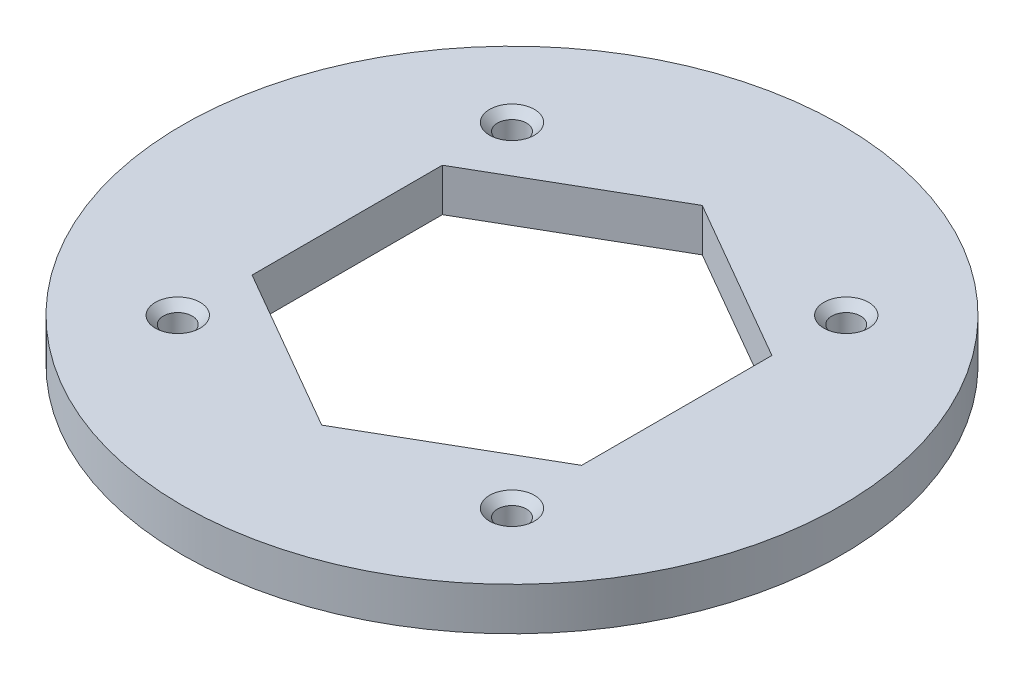
ISO-10303-21;
HEADER;
FILE_DESCRIPTION(('STEP AP214'),'2;1');
FILE_NAME('part.step','',(''),(''),'','','');
FILE_SCHEMA(('AUTOMOTIVE_DESIGN { 1 0 10303 214 1 1 1 1 }'));
ENDSEC;
DATA;
#1=APPLICATION_CONTEXT('core data for automotive mechanical design processes');
#2=APPLICATION_PROTOCOL_DEFINITION('international standard','automotive_design',2000,#1);
#3=PRODUCT_CONTEXT('',#1,'mechanical');
#4=PRODUCT('Part','Part','',(#3));
#5=PRODUCT_RELATED_PRODUCT_CATEGORY('part','',(#4));
#6=PRODUCT_DEFINITION_FORMATION('','',#4);
#7=PRODUCT_DEFINITION_CONTEXT('part definition',#1,'design');
#8=PRODUCT_DEFINITION('design','',#6,#7);
#9=PRODUCT_DEFINITION_SHAPE('','',#8);
#10=(LENGTH_UNIT() NAMED_UNIT(*) SI_UNIT(.MILLI.,.METRE.));
#11=(NAMED_UNIT(*) PLANE_ANGLE_UNIT() SI_UNIT($,.RADIAN.));
#12=(NAMED_UNIT(*) SI_UNIT($,.STERADIAN.) SOLID_ANGLE_UNIT());
#13=UNCERTAINTY_MEASURE_WITH_UNIT(LENGTH_MEASURE(1.E-05),#10,'distance_accuracy_value','');
#14=(GEOMETRIC_REPRESENTATION_CONTEXT(3) GLOBAL_UNCERTAINTY_ASSIGNED_CONTEXT((#13)) GLOBAL_UNIT_ASSIGNED_CONTEXT((#10,
#11,#12)) REPRESENTATION_CONTEXT('',''));
#15=CARTESIAN_POINT('',(0.,0.,0.));
#16=DIRECTION('',(0.,0.,1.));
#17=DIRECTION('',(1.,0.,0.));
#18=AXIS2_PLACEMENT_3D('',#15,#16,#17);
#19=CARTESIAN_POINT('',(0.,6.5,0.));
#20=DIRECTION('',(0.,-1.,0.));
#21=DIRECTION('',(0.,0.,-1.));
#22=AXIS2_PLACEMENT_3D('',#19,#20,#21);
#23=CYLINDRICAL_SURFACE('',#22,50.);
#24=CARTESIAN_POINT('',(0.,6.5,0.));
#25=DIRECTION('',(0.,1.,0.));
#26=DIRECTION('',(0.,0.,1.));
#27=AXIS2_PLACEMENT_3D('',#24,#25,#26);
#28=CIRCLE('',#27,50.);
#29=CARTESIAN_POINT('',(0.,6.5,-50.));
#30=VERTEX_POINT('',#29);
#31=EDGE_CURVE('E161',#30,#30,#28,.T.);
#32=CARTESIAN_POINT('',(0.,0.,0.));
#33=DIRECTION('',(0.,1.,0.));
#34=DIRECTION('',(0.,0.,1.));
#35=AXIS2_PLACEMENT_3D('',#32,#33,#34);
#36=CIRCLE('',#35,50.);
#37=CARTESIAN_POINT('',(0.,0.,-50.));
#38=VERTEX_POINT('',#37);
#39=EDGE_CURVE('E178',#38,#38,#36,.T.);
#40=CARTESIAN_POINT('',(0.,6.5,-50.));
#41=CARTESIAN_POINT('',(0.,6.43229166666667,-50.));
#42=CARTESIAN_POINT('',(0.,6.36458333333333,-50.));
#43=CARTESIAN_POINT('',(0.,6.22916666666667,-50.));
#44=CARTESIAN_POINT('',(0.,6.16145833333333,-50.));
#45=CARTESIAN_POINT('',(0.,6.02604166666667,-50.));
#46=CARTESIAN_POINT('',(0.,5.95833333333333,-50.));
#47=CARTESIAN_POINT('',(0.,5.82291666666667,-50.));
#48=CARTESIAN_POINT('',(0.,5.75520833333333,-50.));
#49=CARTESIAN_POINT('',(0.,5.61979166666667,-50.));
#50=CARTESIAN_POINT('',(0.,5.55208333333333,-50.));
#51=CARTESIAN_POINT('',(0.,5.41666666666667,-50.));
#52=CARTESIAN_POINT('',(0.,5.34895833333333,-50.));
#53=CARTESIAN_POINT('',(0.,5.21354166666667,-50.));
#54=CARTESIAN_POINT('',(0.,5.14583333333333,-50.));
#55=CARTESIAN_POINT('',(0.,5.01041666666667,-50.));
#56=CARTESIAN_POINT('',(0.,4.94270833333333,-50.));
#57=CARTESIAN_POINT('',(0.,4.80729166666667,-50.));
#58=CARTESIAN_POINT('',(0.,4.73958333333333,-50.));
#59=CARTESIAN_POINT('',(0.,4.60416666666667,-50.));
#60=CARTESIAN_POINT('',(0.,4.53645833333333,-50.));
#61=CARTESIAN_POINT('',(0.,4.40104166666667,-50.));
#62=CARTESIAN_POINT('',(0.,4.33333333333333,-50.));
#63=CARTESIAN_POINT('',(0.,4.19791666666667,-50.));
#64=CARTESIAN_POINT('',(0.,4.13020833333333,-50.));
#65=CARTESIAN_POINT('',(0.,3.99479166666667,-50.));
#66=CARTESIAN_POINT('',(0.,3.92708333333333,-50.));
#67=CARTESIAN_POINT('',(0.,3.79166666666667,-50.));
#68=CARTESIAN_POINT('',(0.,3.72395833333333,-50.));
#69=CARTESIAN_POINT('',(0.,3.58854166666667,-50.));
#70=CARTESIAN_POINT('',(0.,3.52083333333333,-50.));
#71=CARTESIAN_POINT('',(0.,3.38541666666667,-50.));
#72=CARTESIAN_POINT('',(0.,3.31770833333333,-50.));
#73=CARTESIAN_POINT('',(0.,3.18229166666667,-50.));
#74=CARTESIAN_POINT('',(0.,3.11458333333333,-50.));
#75=CARTESIAN_POINT('',(0.,2.97916666666667,-50.));
#76=CARTESIAN_POINT('',(0.,2.91145833333333,-50.));
#77=CARTESIAN_POINT('',(0.,2.77604166666667,-50.));
#78=CARTESIAN_POINT('',(0.,2.70833333333333,-50.));
#79=CARTESIAN_POINT('',(0.,2.57291666666667,-50.));
#80=CARTESIAN_POINT('',(0.,2.50520833333333,-50.));
#81=CARTESIAN_POINT('',(0.,2.36979166666667,-50.));
#82=CARTESIAN_POINT('',(0.,2.30208333333333,-50.));
#83=CARTESIAN_POINT('',(0.,2.16666666666667,-50.));
#84=CARTESIAN_POINT('',(0.,2.09895833333333,-50.));
#85=CARTESIAN_POINT('',(0.,1.96354166666667,-50.));
#86=CARTESIAN_POINT('',(0.,1.89583333333333,-50.));
#87=CARTESIAN_POINT('',(0.,1.76041666666667,-50.));
#88=CARTESIAN_POINT('',(0.,1.69270833333333,-50.));
#89=CARTESIAN_POINT('',(0.,1.55729166666667,-50.));
#90=CARTESIAN_POINT('',(0.,1.48958333333333,-50.));
#91=CARTESIAN_POINT('',(0.,1.35416666666667,-50.));
#92=CARTESIAN_POINT('',(0.,1.28645833333333,-50.));
#93=CARTESIAN_POINT('',(0.,1.15104166666667,-50.));
#94=CARTESIAN_POINT('',(0.,1.08333333333333,-50.));
#95=CARTESIAN_POINT('',(0.,0.947916666666667,-50.));
#96=CARTESIAN_POINT('',(0.,0.880208333333333,-50.));
#97=CARTESIAN_POINT('',(0.,0.744791666666667,-50.));
#98=CARTESIAN_POINT('',(0.,0.677083333333333,-50.));
#99=CARTESIAN_POINT('',(0.,0.541666666666667,-50.));
#100=CARTESIAN_POINT('',(0.,0.473958333333333,-50.));
#101=CARTESIAN_POINT('',(0.,0.338541666666667,-50.));
#102=CARTESIAN_POINT('',(0.,0.270833333333334,-50.));
#103=CARTESIAN_POINT('',(0.,0.135416666666667,-50.));
#104=CARTESIAN_POINT('',(0.,0.0677083333333334,-50.));
#105=CARTESIAN_POINT('',(0.,0.,-50.));
#106=B_SPLINE_CURVE_WITH_KNOTS('',3,(#40,#41,#42,#43,#44,#45,#46,#47,#48,#49,#50,#51,#52,#53,
#54,#55,#56,#57,#58,#59,#60,#61,#62,#63,#64,#65,#66,#67,#68,#69,#70,#71,#72,#73,#74,#75,#76,#77,
#78,#79,#80,#81,#82,#83,#84,#85,#86,#87,#88,#89,#90,#91,#92,#93,#94,#95,#96,#97,#98,#99,#100,
#101,#102,#103,#104,#105),.UNSPECIFIED.,.F.,.F.,(4,2,2,2,2,2,2,2,2,2,2,2,2,2,2,2,2,2,2,2,2,2,2,
2,2,2,2,2,2,2,2,2,4),(0.,0.203125,0.40625,0.609375000000001,0.812500000000001,1.015625,1.21875,
1.421875,1.625,1.828125,2.03125,2.234375,2.4375,2.640625,2.84375,3.046875,3.25,3.453125,3.65625,
3.859375,4.0625,4.265625,4.46875,4.671875,4.875,5.078125,5.28125,5.484375,5.6875,5.890625,
6.09375,6.296875,6.5),.UNSPECIFIED.);
#107=EDGE_CURVE('BSEAM47',#30,#38,#106,.T.);
#108=ORIENTED_EDGE('',*,*,#31,.F.);
#109=ORIENTED_EDGE('',*,*,#39,.T.);
#110=ORIENTED_EDGE('',*,*,#107,.T.);
#111=ORIENTED_EDGE('',*,*,#107,.F.);
#112=EDGE_LOOP('',(#108,#110,#109,#111));
#113=FACE_BOUND('',#112,.T.);
#114=ADVANCED_FACE('F47',(#113),#23,.T.);
#115=CARTESIAN_POINT('',(-25.3553390593274,6.5,-25.3553390593274));
#116=DIRECTION('',(0.,-1.,0.));
#117=DIRECTION('',(0.,0.,-1.));
#118=AXIS2_PLACEMENT_3D('',#115,#116,#117);
#119=CYLINDRICAL_SURFACE('',#118,2.2);
#120=CARTESIAN_POINT('',(-25.3553390593274,5.29999999999992,-25.3553390593274));
#121=DIRECTION('',(0.,1.,0.));
#122=DIRECTION('',(0.,0.,1.));
#123=AXIS2_PLACEMENT_3D('',#120,#121,#122);
#124=CIRCLE('',#123,2.2);
#125=CARTESIAN_POINT('',(-25.3553390593274,5.29999999999992,-27.5553390593274));
#126=VERTEX_POINT('',#125);
#127=EDGE_CURVE('E225',#126,#126,#124,.T.);
#128=CARTESIAN_POINT('',(-25.3553390593274,0.,-25.3553390593274));
#129=DIRECTION('',(0.,1.,0.));
#130=DIRECTION('',(0.,0.,1.));
#131=AXIS2_PLACEMENT_3D('',#128,#129,#130);
#132=CIRCLE('',#131,2.2);
#133=CARTESIAN_POINT('',(-25.3553390593274,0.,-27.5553390593274));
#134=VERTEX_POINT('',#133);
#135=EDGE_CURVE('E174',#134,#134,#132,.T.);
#136=CARTESIAN_POINT('',(-25.3553390593274,5.29999999999992,-27.5553390593274));
#137=CARTESIAN_POINT('',(-25.3553390593274,5.24479166666659,-27.5553390593274));
#138=CARTESIAN_POINT('',(-25.3553390593274,5.18958333333326,-27.5553390593274));
#139=CARTESIAN_POINT('',(-25.3553390593274,5.07916666666659,-27.5553390593274));
#140=CARTESIAN_POINT('',(-25.3553390593274,5.02395833333326,-27.5553390593274));
#141=CARTESIAN_POINT('',(-25.3553390593274,4.9135416666666,-27.5553390593274));
#142=CARTESIAN_POINT('',(-25.3553390593274,4.85833333333326,-27.5553390593274));
#143=CARTESIAN_POINT('',(-25.3553390593274,4.7479166666666,-27.5553390593274));
#144=CARTESIAN_POINT('',(-25.3553390593274,4.69270833333327,-27.5553390593274));
#145=CARTESIAN_POINT('',(-25.3553390593274,4.5822916666666,-27.5553390593274));
#146=CARTESIAN_POINT('',(-25.3553390593274,4.52708333333327,-27.5553390593274));
#147=CARTESIAN_POINT('',(-25.3553390593274,4.4166666666666,-27.5553390593274));
#148=CARTESIAN_POINT('',(-25.3553390593274,4.36145833333327,-27.5553390593274));
#149=CARTESIAN_POINT('',(-25.3553390593274,4.25104166666661,-27.5553390593274));
#150=CARTESIAN_POINT('',(-25.3553390593274,4.19583333333327,-27.5553390593274));
#151=CARTESIAN_POINT('',(-25.3553390593274,4.08541666666661,-27.5553390593274));
#152=CARTESIAN_POINT('',(-25.3553390593274,4.03020833333327,-27.5553390593274));
#153=CARTESIAN_POINT('',(-25.3553390593274,3.91979166666661,-27.5553390593274));
#154=CARTESIAN_POINT('',(-25.3553390593274,3.86458333333328,-27.5553390593274));
#155=CARTESIAN_POINT('',(-25.3553390593274,3.75416666666661,-27.5553390593274));
#156=CARTESIAN_POINT('',(-25.3553390593274,3.69895833333328,-27.5553390593274));
#157=CARTESIAN_POINT('',(-25.3553390593274,3.58854166666662,-27.5553390593274));
#158=CARTESIAN_POINT('',(-25.3553390593274,3.53333333333328,-27.5553390593274));
#159=CARTESIAN_POINT('',(-25.3553390593274,3.42291666666662,-27.5553390593274));
#160=CARTESIAN_POINT('',(-25.3553390593274,3.36770833333328,-27.5553390593274));
#161=CARTESIAN_POINT('',(-25.3553390593274,3.25729166666662,-27.5553390593274));
#162=CARTESIAN_POINT('',(-25.3553390593274,3.20208333333329,-27.5553390593274));
#163=CARTESIAN_POINT('',(-25.3553390593274,3.09166666666662,-27.5553390593274));
#164=CARTESIAN_POINT('',(-25.3553390593274,3.03645833333329,-27.5553390593274));
#165=CARTESIAN_POINT('',(-25.3553390593274,2.92604166666662,-27.5553390593274));
#166=CARTESIAN_POINT('',(-25.3553390593274,2.87083333333329,-27.5553390593274));
#167=CARTESIAN_POINT('',(-25.3553390593274,2.76041666666663,-27.5553390593274));
#168=CARTESIAN_POINT('',(-25.3553390593274,2.70520833333329,-27.5553390593274));
#169=CARTESIAN_POINT('',(-25.3553390593274,2.59479166666663,-27.5553390593274));
#170=CARTESIAN_POINT('',(-25.3553390593274,2.5395833333333,-27.5553390593274));
#171=CARTESIAN_POINT('',(-25.3553390593274,2.42916666666663,-27.5553390593274));
#172=CARTESIAN_POINT('',(-25.3553390593274,2.3739583333333,-27.5553390593274));
#173=CARTESIAN_POINT('',(-25.3553390593274,2.26354166666663,-27.5553390593274));
#174=CARTESIAN_POINT('',(-25.3553390593274,2.2083333333333,-27.5553390593274));
#175=CARTESIAN_POINT('',(-25.3553390593274,2.09791666666664,-27.5553390593274));
#176=CARTESIAN_POINT('',(-25.3553390593274,2.0427083333333,-27.5553390593274));
#177=CARTESIAN_POINT('',(-25.3553390593274,1.93229166666664,-27.5553390593274));
#178=CARTESIAN_POINT('',(-25.3553390593274,1.87708333333331,-27.5553390593274));
#179=CARTESIAN_POINT('',(-25.3553390593274,1.76666666666664,-27.5553390593274));
#180=CARTESIAN_POINT('',(-25.3553390593274,1.71145833333331,-27.5553390593274));
#181=CARTESIAN_POINT('',(-25.3553390593274,1.60104166666664,-27.5553390593274));
#182=CARTESIAN_POINT('',(-25.3553390593274,1.54583333333331,-27.5553390593274));
#183=CARTESIAN_POINT('',(-25.3553390593274,1.43541666666665,-27.5553390593274));
#184=CARTESIAN_POINT('',(-25.3553390593274,1.38020833333331,-27.5553390593274));
#185=CARTESIAN_POINT('',(-25.3553390593274,1.26979166666665,-27.5553390593274));
#186=CARTESIAN_POINT('',(-25.3553390593274,1.21458333333332,-27.5553390593274));
#187=CARTESIAN_POINT('',(-25.3553390593274,1.10416666666665,-27.5553390593274));
#188=CARTESIAN_POINT('',(-25.3553390593274,1.04895833333332,-27.5553390593274));
#189=CARTESIAN_POINT('',(-25.3553390593274,0.938541666666654,-27.5553390593274));
#190=CARTESIAN_POINT('',(-25.3553390593274,0.883333333333321,-27.5553390593274));
#191=CARTESIAN_POINT('',(-25.3553390593274,0.772916666666656,-27.5553390593274));
#192=CARTESIAN_POINT('',(-25.3553390593274,0.717708333333323,-27.5553390593274));
#193=CARTESIAN_POINT('',(-25.3553390593274,0.607291666666657,-27.5553390593274));
#194=CARTESIAN_POINT('',(-25.3553390593274,0.552083333333325,-27.5553390593274));
#195=CARTESIAN_POINT('',(-25.3553390593274,0.44166666666666,-27.5553390593274));
#196=CARTESIAN_POINT('',(-25.3553390593274,0.386458333333327,-27.5553390593274));
#197=CARTESIAN_POINT('',(-25.3553390593274,0.276041666666662,-27.5553390593274));
#198=CARTESIAN_POINT('',(-25.3553390593274,0.22083333333333,-27.5553390593274));
#199=CARTESIAN_POINT('',(-25.3553390593274,0.110416666666665,-27.5553390593274));
#200=CARTESIAN_POINT('',(-25.3553390593274,0.0552083333333324,-27.5553390593274));
#201=CARTESIAN_POINT('',(-25.3553390593274,0.,-27.5553390593274));
#202=B_SPLINE_CURVE_WITH_KNOTS('',3,(#136,#137,#138,#139,#140,#141,#142,#143,#144,#145,#146,
#147,#148,#149,#150,#151,#152,#153,#154,#155,#156,#157,#158,#159,#160,#161,#162,#163,#164,#165,
#166,#167,#168,#169,#170,#171,#172,#173,#174,#175,#176,#177,#178,#179,#180,#181,#182,#183,#184,
#185,#186,#187,#188,#189,#190,#191,#192,#193,#194,#195,#196,#197,#198,#199,#200,#201),
.UNSPECIFIED.,.F.,.F.,(4,2,2,2,2,2,2,2,2,2,2,2,2,2,2,2,2,2,2,2,2,2,2,2,2,2,2,2,2,2,2,2,4),(0.,
0.165624999999998,0.331249999999996,0.496874999999993,0.66249999999999,0.828124999999988,
0.993749999999986,1.15937499999998,1.32499999999998,1.49062499999998,1.65624999999998,
1.82187499999997,1.98749999999997,2.15312499999997,2.31874999999997,2.48437499999996,
2.64999999999996,2.81562499999996,2.98124999999996,3.14687499999995,3.31249999999995,
3.47812499999995,3.64374999999995,3.80937499999995,3.97499999999994,4.14062499999994,
4.30624999999994,4.47187499999993,4.63749999999993,4.80312499999993,4.96874999999993,
5.13437499999993,5.29999999999992),.UNSPECIFIED.);
#203=EDGE_CURVE('BSEAM277',#126,#134,#202,.T.);
#204=ORIENTED_EDGE('',*,*,#127,.T.);
#205=ORIENTED_EDGE('',*,*,#135,.F.);
#206=ORIENTED_EDGE('',*,*,#203,.T.);
#207=ORIENTED_EDGE('',*,*,#203,.F.);
#208=EDGE_LOOP('',(#204,#206,#205,#207));
#209=FACE_BOUND('',#208,.T.);
#210=ADVANCED_FACE('F277',(#209),#119,.F.);
#211=CARTESIAN_POINT('',(25.3553390593274,6.5,-25.3553390593274));
#212=DIRECTION('',(0.,-1.,0.));
#213=DIRECTION('',(0.,0.,-1.));
#214=AXIS2_PLACEMENT_3D('',#211,#212,#213);
#215=CYLINDRICAL_SURFACE('',#214,2.2);
#216=CARTESIAN_POINT('',(25.3553390593274,5.30000000000009,-25.3553390593274));
#217=DIRECTION('',(0.,1.,0.));
#218=DIRECTION('',(0.,0.,1.));
#219=AXIS2_PLACEMENT_3D('',#216,#217,#218);
#220=CIRCLE('',#219,2.2);
#221=CARTESIAN_POINT('',(25.3553390593274,5.30000000000009,-27.5553390593274));
#222=VERTEX_POINT('',#221);
#223=EDGE_CURVE('E221',#222,#222,#220,.T.);
#224=CARTESIAN_POINT('',(25.3553390593274,0.,-25.3553390593274));
#225=DIRECTION('',(0.,1.,0.));
#226=DIRECTION('',(0.,0.,1.));
#227=AXIS2_PLACEMENT_3D('',#224,#225,#226);
#228=CIRCLE('',#227,2.2);
#229=CARTESIAN_POINT('',(25.3553390593274,0.,-27.5553390593274));
#230=VERTEX_POINT('',#229);
#231=EDGE_CURVE('E170',#230,#230,#228,.F.);
#232=CARTESIAN_POINT('',(25.3553390593274,5.30000000000009,-27.5553390593274));
#233=CARTESIAN_POINT('',(25.3553390593274,5.24479166666676,-27.5553390593274));
#234=CARTESIAN_POINT('',(25.3553390593274,5.18958333333342,-27.5553390593274));
#235=CARTESIAN_POINT('',(25.3553390593274,5.07916666666675,-27.5553390593274));
#236=CARTESIAN_POINT('',(25.3553390593274,5.02395833333342,-27.5553390593274));
#237=CARTESIAN_POINT('',(25.3553390593274,4.91354166666675,-27.5553390593274));
#238=CARTESIAN_POINT('',(25.3553390593274,4.85833333333342,-27.5553390593274));
#239=CARTESIAN_POINT('',(25.3553390593274,4.74791666666675,-27.5553390593274));
#240=CARTESIAN_POINT('',(25.3553390593274,4.69270833333341,-27.5553390593274));
#241=CARTESIAN_POINT('',(25.3553390593274,4.58229166666674,-27.5553390593274));
#242=CARTESIAN_POINT('',(25.3553390593274,4.52708333333341,-27.5553390593274));
#243=CARTESIAN_POINT('',(25.3553390593274,4.41666666666674,-27.5553390593274));
#244=CARTESIAN_POINT('',(25.3553390593274,4.36145833333341,-27.5553390593274));
#245=CARTESIAN_POINT('',(25.3553390593274,4.25104166666674,-27.5553390593274));
#246=CARTESIAN_POINT('',(25.3553390593274,4.1958333333334,-27.5553390593274));
#247=CARTESIAN_POINT('',(25.3553390593274,4.08541666666674,-27.5553390593274));
#248=CARTESIAN_POINT('',(25.3553390593274,4.0302083333334,-27.5553390593274));
#249=CARTESIAN_POINT('',(25.3553390593274,3.91979166666673,-27.5553390593274));
#250=CARTESIAN_POINT('',(25.3553390593274,3.8645833333334,-27.5553390593274));
#251=CARTESIAN_POINT('',(25.3553390593274,3.75416666666673,-27.5553390593274));
#252=CARTESIAN_POINT('',(25.3553390593274,3.6989583333334,-27.5553390593274));
#253=CARTESIAN_POINT('',(25.3553390593274,3.58854166666673,-27.5553390593274));
#254=CARTESIAN_POINT('',(25.3553390593274,3.53333333333339,-27.5553390593274));
#255=CARTESIAN_POINT('',(25.3553390593274,3.42291666666672,-27.5553390593274));
#256=CARTESIAN_POINT('',(25.3553390593274,3.36770833333339,-27.5553390593274));
#257=CARTESIAN_POINT('',(25.3553390593274,3.25729166666672,-27.5553390593274));
#258=CARTESIAN_POINT('',(25.3553390593274,3.20208333333339,-27.5553390593274));
#259=CARTESIAN_POINT('',(25.3553390593274,3.09166666666672,-27.5553390593274));
#260=CARTESIAN_POINT('',(25.3553390593274,3.03645833333338,-27.5553390593274));
#261=CARTESIAN_POINT('',(25.3553390593274,2.92604166666672,-27.5553390593274));
#262=CARTESIAN_POINT('',(25.3553390593274,2.87083333333338,-27.5553390593274));
#263=CARTESIAN_POINT('',(25.3553390593274,2.76041666666671,-27.5553390593274));
#264=CARTESIAN_POINT('',(25.3553390593274,2.70520833333338,-27.5553390593274));
#265=CARTESIAN_POINT('',(25.3553390593274,2.59479166666671,-27.5553390593274));
#266=CARTESIAN_POINT('',(25.3553390593274,2.53958333333338,-27.5553390593274));
#267=CARTESIAN_POINT('',(25.3553390593274,2.42916666666671,-27.5553390593274));
#268=CARTESIAN_POINT('',(25.3553390593274,2.37395833333337,-27.5553390593274));
#269=CARTESIAN_POINT('',(25.3553390593274,2.26354166666671,-27.5553390593274));
#270=CARTESIAN_POINT('',(25.3553390593274,2.20833333333337,-27.5553390593274));
#271=CARTESIAN_POINT('',(25.3553390593274,2.0979166666667,-27.5553390593274));
#272=CARTESIAN_POINT('',(25.3553390593274,2.04270833333337,-27.5553390593274));
#273=CARTESIAN_POINT('',(25.3553390593274,1.9322916666667,-27.5553390593274));
#274=CARTESIAN_POINT('',(25.3553390593274,1.87708333333337,-27.5553390593274));
#275=CARTESIAN_POINT('',(25.3553390593274,1.7666666666667,-27.5553390593274));
#276=CARTESIAN_POINT('',(25.3553390593274,1.71145833333336,-27.5553390593274));
#277=CARTESIAN_POINT('',(25.3553390593274,1.60104166666669,-27.5553390593274));
#278=CARTESIAN_POINT('',(25.3553390593274,1.54583333333336,-27.5553390593274));
#279=CARTESIAN_POINT('',(25.3553390593274,1.43541666666669,-27.5553390593274));
#280=CARTESIAN_POINT('',(25.3553390593274,1.38020833333336,-27.5553390593274));
#281=CARTESIAN_POINT('',(25.3553390593274,1.26979166666669,-27.5553390593274));
#282=CARTESIAN_POINT('',(25.3553390593274,1.21458333333335,-27.5553390593274));
#283=CARTESIAN_POINT('',(25.3553390593274,1.10416666666669,-27.5553390593274));
#284=CARTESIAN_POINT('',(25.3553390593274,1.04895833333335,-27.5553390593274));
#285=CARTESIAN_POINT('',(25.3553390593274,0.938541666666683,-27.5553390593274));
#286=CARTESIAN_POINT('',(25.3553390593274,0.883333333333349,-27.5553390593274));
#287=CARTESIAN_POINT('',(25.3553390593274,0.77291666666668,-27.5553390593274));
#288=CARTESIAN_POINT('',(25.3553390593274,0.717708333333345,-27.5553390593274));
#289=CARTESIAN_POINT('',(25.3553390593274,0.607291666666676,-27.5553390593274));
#290=CARTESIAN_POINT('',(25.3553390593274,0.552083333333342,-27.5553390593274));
#291=CARTESIAN_POINT('',(25.3553390593274,0.441666666666674,-27.5553390593274));
#292=CARTESIAN_POINT('',(25.3553390593274,0.386458333333339,-27.5553390593274));
#293=CARTESIAN_POINT('',(25.3553390593274,0.276041666666671,-27.5553390593274));
#294=CARTESIAN_POINT('',(25.3553390593274,0.220833333333337,-27.5553390593274));
#295=CARTESIAN_POINT('',(25.3553390593274,0.110416666666668,-27.5553390593274));
#296=CARTESIAN_POINT('',(25.3553390593274,0.0552083333333342,-27.5553390593274));
#297=CARTESIAN_POINT('',(25.3553390593274,0.,-27.5553390593274));
#298=B_SPLINE_CURVE_WITH_KNOTS('',3,(#232,#233,#234,#235,#236,#237,#238,#239,#240,#241,#242,
#243,#244,#245,#246,#247,#248,#249,#250,#251,#252,#253,#254,#255,#256,#257,#258,#259,#260,#261,
#262,#263,#264,#265,#266,#267,#268,#269,#270,#271,#272,#273,#274,#275,#276,#277,#278,#279,#280,
#281,#282,#283,#284,#285,#286,#287,#288,#289,#290,#291,#292,#293,#294,#295,#296,#297),
.UNSPECIFIED.,.F.,.F.,(4,2,2,2,2,2,2,2,2,2,2,2,2,2,2,2,2,2,2,2,2,2,2,2,2,2,2,2,2,2,2,2,4),(0.,
0.165625000000003,0.331250000000006,0.496875000000009,0.662500000000011,0.828125000000014,
0.993750000000017,1.15937500000002,1.32500000000002,1.49062500000003,1.65625000000003,
1.82187500000003,1.98750000000003,2.15312500000004,2.31875000000004,2.48437500000004,
2.65000000000005,2.81562500000005,2.98125000000005,3.14687500000005,3.31250000000006,
3.47812500000006,3.64375000000006,3.80937500000007,3.97500000000007,4.14062500000007,
4.30625000000007,4.47187500000008,4.63750000000008,4.80312500000008,4.96875000000009,
5.13437500000009,5.30000000000009),.UNSPECIFIED.);
#299=EDGE_CURVE('BSEAM255',#222,#230,#298,.T.);
#300=ORIENTED_EDGE('',*,*,#223,.T.);
#301=ORIENTED_EDGE('',*,*,#231,.T.);
#302=ORIENTED_EDGE('',*,*,#299,.T.);
#303=ORIENTED_EDGE('',*,*,#299,.F.);
#304=EDGE_LOOP('',(#300,#302,#301,#303));
#305=FACE_BOUND('',#304,.T.);
#306=ADVANCED_FACE('F255',(#305),#215,.F.);
#307=CARTESIAN_POINT('',(25.3553390593274,6.5,25.3553390593274));
#308=DIRECTION('',(0.,-1.,0.));
#309=DIRECTION('',(0.,0.,-1.));
#310=AXIS2_PLACEMENT_3D('',#307,#308,#309);
#311=CYLINDRICAL_SURFACE('',#310,2.2);
#312=CARTESIAN_POINT('',(25.3553390593274,5.29999999999992,25.3553390593274));
#313=DIRECTION('',(0.,1.,0.));
#314=DIRECTION('',(0.,0.,1.));
#315=AXIS2_PLACEMENT_3D('',#312,#313,#314);
#316=CIRCLE('',#315,2.2);
#317=CARTESIAN_POINT('',(25.3553390593274,5.29999999999992,23.1553390593274));
#318=VERTEX_POINT('',#317);
#319=EDGE_CURVE('E11',#318,#318,#316,.T.);
#320=CARTESIAN_POINT('',(25.3553390593274,0.,25.3553390593274));
#321=DIRECTION('',(0.,1.,0.));
#322=DIRECTION('',(0.,0.,1.));
#323=AXIS2_PLACEMENT_3D('',#320,#321,#322);
#324=CIRCLE('',#323,2.2);
#325=CARTESIAN_POINT('',(25.3553390593274,0.,23.1553390593274));
#326=VERTEX_POINT('',#325);
#327=EDGE_CURVE('E157',#326,#326,#324,.T.);
#328=CARTESIAN_POINT('',(25.3553390593274,5.29999999999992,23.1553390593274));
#329=CARTESIAN_POINT('',(25.3553390593274,5.24479166666659,23.1553390593274));
#330=CARTESIAN_POINT('',(25.3553390593274,5.18958333333326,23.1553390593274));
#331=CARTESIAN_POINT('',(25.3553390593274,5.07916666666659,23.1553390593274));
#332=CARTESIAN_POINT('',(25.3553390593274,5.02395833333326,23.1553390593274));
#333=CARTESIAN_POINT('',(25.3553390593274,4.9135416666666,23.1553390593274));
#334=CARTESIAN_POINT('',(25.3553390593274,4.85833333333326,23.1553390593274));
#335=CARTESIAN_POINT('',(25.3553390593274,4.7479166666666,23.1553390593274));
#336=CARTESIAN_POINT('',(25.3553390593274,4.69270833333327,23.1553390593274));
#337=CARTESIAN_POINT('',(25.3553390593274,4.5822916666666,23.1553390593274));
#338=CARTESIAN_POINT('',(25.3553390593274,4.52708333333327,23.1553390593274));
#339=CARTESIAN_POINT('',(25.3553390593274,4.4166666666666,23.1553390593274));
#340=CARTESIAN_POINT('',(25.3553390593274,4.36145833333327,23.1553390593274));
#341=CARTESIAN_POINT('',(25.3553390593274,4.25104166666661,23.1553390593274));
#342=CARTESIAN_POINT('',(25.3553390593274,4.19583333333327,23.1553390593274));
#343=CARTESIAN_POINT('',(25.3553390593274,4.08541666666661,23.1553390593274));
#344=CARTESIAN_POINT('',(25.3553390593274,4.03020833333327,23.1553390593274));
#345=CARTESIAN_POINT('',(25.3553390593274,3.91979166666661,23.1553390593274));
#346=CARTESIAN_POINT('',(25.3553390593274,3.86458333333328,23.1553390593274));
#347=CARTESIAN_POINT('',(25.3553390593274,3.75416666666661,23.1553390593274));
#348=CARTESIAN_POINT('',(25.3553390593274,3.69895833333328,23.1553390593274));
#349=CARTESIAN_POINT('',(25.3553390593274,3.58854166666662,23.1553390593274));
#350=CARTESIAN_POINT('',(25.3553390593274,3.53333333333328,23.1553390593274));
#351=CARTESIAN_POINT('',(25.3553390593274,3.42291666666662,23.1553390593274));
#352=CARTESIAN_POINT('',(25.3553390593274,3.36770833333328,23.1553390593274));
#353=CARTESIAN_POINT('',(25.3553390593274,3.25729166666662,23.1553390593274));
#354=CARTESIAN_POINT('',(25.3553390593274,3.20208333333329,23.1553390593274));
#355=CARTESIAN_POINT('',(25.3553390593274,3.09166666666662,23.1553390593274));
#356=CARTESIAN_POINT('',(25.3553390593274,3.03645833333329,23.1553390593274));
#357=CARTESIAN_POINT('',(25.3553390593274,2.92604166666662,23.1553390593274));
#358=CARTESIAN_POINT('',(25.3553390593274,2.87083333333329,23.1553390593274));
#359=CARTESIAN_POINT('',(25.3553390593274,2.76041666666663,23.1553390593274));
#360=CARTESIAN_POINT('',(25.3553390593274,2.70520833333329,23.1553390593274));
#361=CARTESIAN_POINT('',(25.3553390593274,2.59479166666663,23.1553390593274));
#362=CARTESIAN_POINT('',(25.3553390593274,2.5395833333333,23.1553390593274));
#363=CARTESIAN_POINT('',(25.3553390593274,2.42916666666663,23.1553390593274));
#364=CARTESIAN_POINT('',(25.3553390593274,2.3739583333333,23.1553390593274));
#365=CARTESIAN_POINT('',(25.3553390593274,2.26354166666663,23.1553390593274));
#366=CARTESIAN_POINT('',(25.3553390593274,2.2083333333333,23.1553390593274));
#367=CARTESIAN_POINT('',(25.3553390593274,2.09791666666664,23.1553390593274));
#368=CARTESIAN_POINT('',(25.3553390593274,2.0427083333333,23.1553390593274));
#369=CARTESIAN_POINT('',(25.3553390593274,1.93229166666664,23.1553390593274));
#370=CARTESIAN_POINT('',(25.3553390593274,1.87708333333331,23.1553390593274));
#371=CARTESIAN_POINT('',(25.3553390593274,1.76666666666664,23.1553390593274));
#372=CARTESIAN_POINT('',(25.3553390593274,1.71145833333331,23.1553390593274));
#373=CARTESIAN_POINT('',(25.3553390593274,1.60104166666664,23.1553390593274));
#374=CARTESIAN_POINT('',(25.3553390593274,1.54583333333331,23.1553390593274));
#375=CARTESIAN_POINT('',(25.3553390593274,1.43541666666665,23.1553390593274));
#376=CARTESIAN_POINT('',(25.3553390593274,1.38020833333331,23.1553390593274));
#377=CARTESIAN_POINT('',(25.3553390593274,1.26979166666665,23.1553390593274));
#378=CARTESIAN_POINT('',(25.3553390593274,1.21458333333332,23.1553390593274));
#379=CARTESIAN_POINT('',(25.3553390593274,1.10416666666665,23.1553390593274));
#380=CARTESIAN_POINT('',(25.3553390593274,1.04895833333332,23.1553390593274));
#381=CARTESIAN_POINT('',(25.3553390593274,0.938541666666654,23.1553390593274));
#382=CARTESIAN_POINT('',(25.3553390593274,0.883333333333321,23.1553390593274));
#383=CARTESIAN_POINT('',(25.3553390593274,0.772916666666656,23.1553390593274));
#384=CARTESIAN_POINT('',(25.3553390593274,0.717708333333323,23.1553390593274));
#385=CARTESIAN_POINT('',(25.3553390593274,0.607291666666657,23.1553390593274));
#386=CARTESIAN_POINT('',(25.3553390593274,0.552083333333325,23.1553390593274));
#387=CARTESIAN_POINT('',(25.3553390593274,0.44166666666666,23.1553390593274));
#388=CARTESIAN_POINT('',(25.3553390593274,0.386458333333327,23.1553390593274));
#389=CARTESIAN_POINT('',(25.3553390593274,0.276041666666662,23.1553390593274));
#390=CARTESIAN_POINT('',(25.3553390593274,0.22083333333333,23.1553390593274));
#391=CARTESIAN_POINT('',(25.3553390593274,0.110416666666665,23.1553390593274));
#392=CARTESIAN_POINT('',(25.3553390593274,0.0552083333333324,23.1553390593274));
#393=CARTESIAN_POINT('',(25.3553390593274,0.,23.1553390593274));
#394=B_SPLINE_CURVE_WITH_KNOTS('',3,(#328,#329,#330,#331,#332,#333,#334,#335,#336,#337,#338,
#339,#340,#341,#342,#343,#344,#345,#346,#347,#348,#349,#350,#351,#352,#353,#354,#355,#356,#357,
#358,#359,#360,#361,#362,#363,#364,#365,#366,#367,#368,#369,#370,#371,#372,#373,#374,#375,#376,
#377,#378,#379,#380,#381,#382,#383,#384,#385,#386,#387,#388,#389,#390,#391,#392,#393),
.UNSPECIFIED.,.F.,.F.,(4,2,2,2,2,2,2,2,2,2,2,2,2,2,2,2,2,2,2,2,2,2,2,2,2,2,2,2,2,2,2,2,4),(0.,
0.165624999999998,0.331249999999996,0.496874999999993,0.66249999999999,0.828124999999988,
0.993749999999986,1.15937499999998,1.32499999999998,1.49062499999998,1.65624999999998,
1.82187499999997,1.98749999999997,2.15312499999997,2.31874999999997,2.48437499999996,
2.64999999999996,2.81562499999996,2.98124999999996,3.14687499999995,3.31249999999995,
3.47812499999995,3.64374999999995,3.80937499999995,3.97499999999994,4.14062499999994,
4.30624999999994,4.47187499999993,4.63749999999993,4.80312499999993,4.96874999999993,
5.13437499999993,5.29999999999992),.UNSPECIFIED.);
#395=EDGE_CURVE('BSEAM252',#318,#326,#394,.T.);
#396=ORIENTED_EDGE('',*,*,#319,.T.);
#397=ORIENTED_EDGE('',*,*,#327,.F.);
#398=ORIENTED_EDGE('',*,*,#395,.T.);
#399=ORIENTED_EDGE('',*,*,#395,.F.);
#400=EDGE_LOOP('',(#396,#398,#397,#399));
#401=FACE_BOUND('',#400,.T.);
#402=ADVANCED_FACE('F252',(#401),#311,.F.);
#403=CARTESIAN_POINT('',(-25.3553390593274,6.5,25.3553390593274));
#404=DIRECTION('',(0.,-1.,0.));
#405=DIRECTION('',(0.,0.,-1.));
#406=AXIS2_PLACEMENT_3D('',#403,#404,#405);
#407=CYLINDRICAL_SURFACE('',#406,2.2);
#408=CARTESIAN_POINT('',(-25.3553390593274,5.30000000000009,25.3553390593274));
#409=DIRECTION('',(0.,1.,0.));
#410=DIRECTION('',(0.,0.,1.));
#411=AXIS2_PLACEMENT_3D('',#408,#409,#410);
#412=CIRCLE('',#411,2.2);
#413=CARTESIAN_POINT('',(-25.3553390593274,5.30000000000009,23.1553390593274));
#414=VERTEX_POINT('',#413);
#415=EDGE_CURVE('E57',#414,#414,#412,.T.);
#416=CARTESIAN_POINT('',(-25.3553390593274,0.,25.3553390593274));
#417=DIRECTION('',(0.,1.,0.));
#418=DIRECTION('',(0.,0.,1.));
#419=AXIS2_PLACEMENT_3D('',#416,#417,#418);
#420=CIRCLE('',#419,2.2);
#421=CARTESIAN_POINT('',(-25.3553390593274,0.,23.1553390593274));
#422=VERTEX_POINT('',#421);
#423=EDGE_CURVE('E166',#422,#422,#420,.F.);
#424=CARTESIAN_POINT('',(-25.3553390593274,5.30000000000009,23.1553390593274));
#425=CARTESIAN_POINT('',(-25.3553390593274,5.24479166666676,23.1553390593274));
#426=CARTESIAN_POINT('',(-25.3553390593274,5.18958333333342,23.1553390593274));
#427=CARTESIAN_POINT('',(-25.3553390593274,5.07916666666675,23.1553390593274));
#428=CARTESIAN_POINT('',(-25.3553390593274,5.02395833333342,23.1553390593274));
#429=CARTESIAN_POINT('',(-25.3553390593274,4.91354166666675,23.1553390593274));
#430=CARTESIAN_POINT('',(-25.3553390593274,4.85833333333342,23.1553390593274));
#431=CARTESIAN_POINT('',(-25.3553390593274,4.74791666666675,23.1553390593274));
#432=CARTESIAN_POINT('',(-25.3553390593274,4.69270833333341,23.1553390593274));
#433=CARTESIAN_POINT('',(-25.3553390593274,4.58229166666674,23.1553390593274));
#434=CARTESIAN_POINT('',(-25.3553390593274,4.52708333333341,23.1553390593274));
#435=CARTESIAN_POINT('',(-25.3553390593274,4.41666666666674,23.1553390593274));
#436=CARTESIAN_POINT('',(-25.3553390593274,4.36145833333341,23.1553390593274));
#437=CARTESIAN_POINT('',(-25.3553390593274,4.25104166666674,23.1553390593274));
#438=CARTESIAN_POINT('',(-25.3553390593274,4.1958333333334,23.1553390593274));
#439=CARTESIAN_POINT('',(-25.3553390593274,4.08541666666674,23.1553390593274));
#440=CARTESIAN_POINT('',(-25.3553390593274,4.0302083333334,23.1553390593274));
#441=CARTESIAN_POINT('',(-25.3553390593274,3.91979166666673,23.1553390593274));
#442=CARTESIAN_POINT('',(-25.3553390593274,3.8645833333334,23.1553390593274));
#443=CARTESIAN_POINT('',(-25.3553390593274,3.75416666666673,23.1553390593274));
#444=CARTESIAN_POINT('',(-25.3553390593274,3.6989583333334,23.1553390593274));
#445=CARTESIAN_POINT('',(-25.3553390593274,3.58854166666673,23.1553390593274));
#446=CARTESIAN_POINT('',(-25.3553390593274,3.53333333333339,23.1553390593274));
#447=CARTESIAN_POINT('',(-25.3553390593274,3.42291666666672,23.1553390593274));
#448=CARTESIAN_POINT('',(-25.3553390593274,3.36770833333339,23.1553390593274));
#449=CARTESIAN_POINT('',(-25.3553390593274,3.25729166666672,23.1553390593274));
#450=CARTESIAN_POINT('',(-25.3553390593274,3.20208333333339,23.1553390593274));
#451=CARTESIAN_POINT('',(-25.3553390593274,3.09166666666672,23.1553390593274));
#452=CARTESIAN_POINT('',(-25.3553390593274,3.03645833333338,23.1553390593274));
#453=CARTESIAN_POINT('',(-25.3553390593274,2.92604166666672,23.1553390593274));
#454=CARTESIAN_POINT('',(-25.3553390593274,2.87083333333338,23.1553390593274));
#455=CARTESIAN_POINT('',(-25.3553390593274,2.76041666666671,23.1553390593274));
#456=CARTESIAN_POINT('',(-25.3553390593274,2.70520833333338,23.1553390593274));
#457=CARTESIAN_POINT('',(-25.3553390593274,2.59479166666671,23.1553390593274));
#458=CARTESIAN_POINT('',(-25.3553390593274,2.53958333333338,23.1553390593274));
#459=CARTESIAN_POINT('',(-25.3553390593274,2.42916666666671,23.1553390593274));
#460=CARTESIAN_POINT('',(-25.3553390593274,2.37395833333337,23.1553390593274));
#461=CARTESIAN_POINT('',(-25.3553390593274,2.26354166666671,23.1553390593274));
#462=CARTESIAN_POINT('',(-25.3553390593274,2.20833333333337,23.1553390593274));
#463=CARTESIAN_POINT('',(-25.3553390593274,2.0979166666667,23.1553390593274));
#464=CARTESIAN_POINT('',(-25.3553390593274,2.04270833333337,23.1553390593274));
#465=CARTESIAN_POINT('',(-25.3553390593274,1.9322916666667,23.1553390593274));
#466=CARTESIAN_POINT('',(-25.3553390593274,1.87708333333337,23.1553390593274));
#467=CARTESIAN_POINT('',(-25.3553390593274,1.7666666666667,23.1553390593274));
#468=CARTESIAN_POINT('',(-25.3553390593274,1.71145833333336,23.1553390593274));
#469=CARTESIAN_POINT('',(-25.3553390593274,1.60104166666669,23.1553390593274));
#470=CARTESIAN_POINT('',(-25.3553390593274,1.54583333333336,23.1553390593274));
#471=CARTESIAN_POINT('',(-25.3553390593274,1.43541666666669,23.1553390593274));
#472=CARTESIAN_POINT('',(-25.3553390593274,1.38020833333336,23.1553390593274));
#473=CARTESIAN_POINT('',(-25.3553390593274,1.26979166666669,23.1553390593274));
#474=CARTESIAN_POINT('',(-25.3553390593274,1.21458333333335,23.1553390593274));
#475=CARTESIAN_POINT('',(-25.3553390593274,1.10416666666669,23.1553390593274));
#476=CARTESIAN_POINT('',(-25.3553390593274,1.04895833333335,23.1553390593274));
#477=CARTESIAN_POINT('',(-25.3553390593274,0.938541666666683,23.1553390593274));
#478=CARTESIAN_POINT('',(-25.3553390593274,0.883333333333349,23.1553390593274));
#479=CARTESIAN_POINT('',(-25.3553390593274,0.77291666666668,23.1553390593274));
#480=CARTESIAN_POINT('',(-25.3553390593274,0.717708333333345,23.1553390593274));
#481=CARTESIAN_POINT('',(-25.3553390593274,0.607291666666676,23.1553390593274));
#482=CARTESIAN_POINT('',(-25.3553390593274,0.552083333333342,23.1553390593274));
#483=CARTESIAN_POINT('',(-25.3553390593274,0.441666666666674,23.1553390593274));
#484=CARTESIAN_POINT('',(-25.3553390593274,0.386458333333339,23.1553390593274));
#485=CARTESIAN_POINT('',(-25.3553390593274,0.276041666666671,23.1553390593274));
#486=CARTESIAN_POINT('',(-25.3553390593274,0.220833333333337,23.1553390593274));
#487=CARTESIAN_POINT('',(-25.3553390593274,0.110416666666668,23.1553390593274));
#488=CARTESIAN_POINT('',(-25.3553390593274,0.0552083333333342,23.1553390593274));
#489=CARTESIAN_POINT('',(-25.3553390593274,0.,23.1553390593274));
#490=B_SPLINE_CURVE_WITH_KNOTS('',3,(#424,#425,#426,#427,#428,#429,#430,#431,#432,#433,#434,
#435,#436,#437,#438,#439,#440,#441,#442,#443,#444,#445,#446,#447,#448,#449,#450,#451,#452,#453,
#454,#455,#456,#457,#458,#459,#460,#461,#462,#463,#464,#465,#466,#467,#468,#469,#470,#471,#472,
#473,#474,#475,#476,#477,#478,#479,#480,#481,#482,#483,#484,#485,#486,#487,#488,#489),
.UNSPECIFIED.,.F.,.F.,(4,2,2,2,2,2,2,2,2,2,2,2,2,2,2,2,2,2,2,2,2,2,2,2,2,2,2,2,2,2,2,2,4),(0.,
0.165625000000003,0.331250000000006,0.496875000000009,0.662500000000011,0.828125000000014,
0.993750000000017,1.15937500000002,1.32500000000002,1.49062500000003,1.65625000000003,
1.82187500000003,1.98750000000003,2.15312500000004,2.31875000000004,2.48437500000004,
2.65000000000005,2.81562500000005,2.98125000000005,3.14687500000005,3.31250000000006,
3.47812500000006,3.64375000000006,3.80937500000007,3.97500000000007,4.14062500000007,
4.30625000000007,4.47187500000008,4.63750000000008,4.80312500000008,4.96875000000009,
5.13437500000009,5.30000000000009),.UNSPECIFIED.);
#491=EDGE_CURVE('BSEAM232',#414,#422,#490,.T.);
#492=ORIENTED_EDGE('',*,*,#415,.T.);
#493=ORIENTED_EDGE('',*,*,#423,.T.);
#494=ORIENTED_EDGE('',*,*,#491,.T.);
#495=ORIENTED_EDGE('',*,*,#491,.F.);
#496=EDGE_LOOP('',(#492,#494,#493,#495));
#497=FACE_BOUND('',#496,.T.);
#498=ADVANCED_FACE('F232',(#497),#407,.F.);
#499=CARTESIAN_POINT('',(0.,6.5,0.));
#500=DIRECTION('',(0.,1.,0.));
#501=DIRECTION('',(0.,0.,1.));
#502=AXIS2_PLACEMENT_3D('',#499,#500,#501);
#503=PLANE('',#502);
#504=CARTESIAN_POINT('',(25.3553390593274,6.5,-25.3553390593274));
#505=DIRECTION('',(0.,1.,0.));
#506=DIRECTION('',(0.,0.,1.));
#507=AXIS2_PLACEMENT_3D('',#504,#505,#506);
#508=CIRCLE('',#507,3.39999999999992);
#509=CARTESIAN_POINT('',(25.3553390593274,6.5,-21.9553390593275));
#510=VERTEX_POINT('',#509);
#511=EDGE_CURVE('E217',#510,#510,#508,.F.);
#512=ORIENTED_EDGE('',*,*,#511,.T.);
#513=EDGE_LOOP('',(#512));
#514=FACE_BOUND('',#513,.T.);
#515=CARTESIAN_POINT('',(-25.3553390593274,6.5,-25.3553390593274));
#516=DIRECTION('',(0.,1.,0.));
#517=DIRECTION('',(0.,0.,1.));
#518=AXIS2_PLACEMENT_3D('',#515,#516,#517);
#519=CIRCLE('',#518,3.40000000000008);
#520=CARTESIAN_POINT('',(-25.3553390593274,6.5,-21.9553390593273));
#521=VERTEX_POINT('',#520);
#522=EDGE_CURVE('E213',#521,#521,#519,.F.);
#523=ORIENTED_EDGE('',*,*,#522,.T.);
#524=EDGE_LOOP('',(#523));
#525=FACE_BOUND('',#524,.T.);
#526=CARTESIAN_POINT('',(-25.3553390593274,6.5,25.3553390593274));
#527=DIRECTION('',(0.,1.,0.));
#528=DIRECTION('',(0.,0.,1.));
#529=AXIS2_PLACEMENT_3D('',#526,#527,#528);
#530=CIRCLE('',#529,3.39999999999992);
#531=CARTESIAN_POINT('',(-25.3553390593274,6.5,28.7553390593273));
#532=VERTEX_POINT('',#531);
#533=EDGE_CURVE('E209',#532,#532,#530,.F.);
#534=ORIENTED_EDGE('',*,*,#533,.T.);
#535=EDGE_LOOP('',(#534));
#536=FACE_BOUND('',#535,.T.);
#537=CARTESIAN_POINT('',(25.3553390593274,6.5,25.3553390593274));
#538=DIRECTION('',(0.,1.,0.));
#539=DIRECTION('',(0.,0.,1.));
#540=AXIS2_PLACEMENT_3D('',#537,#538,#539);
#541=CIRCLE('',#540,3.40000000000008);
#542=CARTESIAN_POINT('',(25.3553390593274,6.5,28.7553390593275));
#543=VERTEX_POINT('',#542);
#544=EDGE_CURVE('E205',#543,#543,#541,.F.);
#545=ORIENTED_EDGE('',*,*,#544,.T.);
#546=EDGE_LOOP('',(#545));
#547=FACE_BOUND('',#546,.T.);
#548=DIRECTION('',(-0.866025403784439,0.,-0.5));
#549=VECTOR('',#548,1.);
#550=CARTESIAN_POINT('',(25.,6.5,-14.4337567297407));
#551=LINE('',#550,#549);
#552=CARTESIAN_POINT('',(25.,6.5,-14.4337567297407));
#553=VERTEX_POINT('',#552);
#554=CARTESIAN_POINT('',(0.,6.5,-28.8675134594813));
#555=VERTEX_POINT('',#554);
#556=EDGE_CURVE('E64',#553,#555,#551,.T.);
#557=ORIENTED_EDGE('',*,*,#556,.F.);
#558=DIRECTION('',(0.,0.,-1.));
#559=VECTOR('',#558,1.);
#560=CARTESIAN_POINT('',(25.,6.5,14.4337567297406));
#561=LINE('',#560,#559);
#562=CARTESIAN_POINT('',(25.,6.5,14.4337567297406));
#563=VERTEX_POINT('',#562);
#564=EDGE_CURVE('E135',#563,#553,#561,.T.);
#565=ORIENTED_EDGE('',*,*,#564,.F.);
#566=DIRECTION('',(0.866025403784438,0.,-0.5));
#567=VECTOR('',#566,1.);
#568=CARTESIAN_POINT('',(0.,6.5,28.8675134594813));
#569=LINE('',#568,#567);
#570=CARTESIAN_POINT('',(0.,6.5,28.8675134594813));
#571=VERTEX_POINT('',#570);
#572=EDGE_CURVE('E128',#571,#563,#569,.T.);
#573=ORIENTED_EDGE('',*,*,#572,.F.);
#574=DIRECTION('',(0.866025403784439,0.,0.5));
#575=VECTOR('',#574,1.);
#576=CARTESIAN_POINT('',(-25.,6.5,14.4337567297407));
#577=LINE('',#576,#575);
#578=CARTESIAN_POINT('',(-25.,6.5,14.4337567297407));
#579=VERTEX_POINT('',#578);
#580=EDGE_CURVE('E124',#579,#571,#577,.T.);
#581=ORIENTED_EDGE('',*,*,#580,.F.);
#582=DIRECTION('',(0.,0.,1.));
#583=VECTOR('',#582,1.);
#584=CARTESIAN_POINT('',(-25.,6.5,-14.4337567297406));
#585=LINE('',#584,#583);
#586=CARTESIAN_POINT('',(-25.,6.5,-14.4337567297406));
#587=VERTEX_POINT('',#586);
#588=EDGE_CURVE('E105',#587,#579,#585,.T.);
#589=ORIENTED_EDGE('',*,*,#588,.F.);
#590=DIRECTION('',(-0.866025403784438,0.,0.5));
#591=VECTOR('',#590,1.);
#592=CARTESIAN_POINT('',(0.,6.5,-28.8675134594813));
#593=LINE('',#592,#591);
#594=EDGE_CURVE('E115',#555,#587,#593,.T.);
#595=ORIENTED_EDGE('',*,*,#594,.F.);
#596=EDGE_LOOP('',(#557,#565,#573,#581,#589,#595));
#597=FACE_BOUND('',#596,.T.);
#598=ORIENTED_EDGE('',*,*,#31,.T.);
#599=EDGE_LOOP('',(#598));
#600=FACE_BOUND('',#599,.T.);
#601=ADVANCED_FACE('F120',(#514,#525,#536,#547,#597,#600),#503,.T.);
#602=CARTESIAN_POINT('',(0.,0.,0.));
#603=DIRECTION('',(0.,1.,0.));
#604=DIRECTION('',(0.,0.,1.));
#605=AXIS2_PLACEMENT_3D('',#602,#603,#604);
#606=PLANE('',#605);
#607=DIRECTION('',(0.,0.,-1.));
#608=VECTOR('',#607,1.);
#609=CARTESIAN_POINT('',(25.,0.,0.));
#610=LINE('',#609,#608);
#611=CARTESIAN_POINT('',(25.,0.,14.4337567297406));
#612=VERTEX_POINT('',#611);
#613=CARTESIAN_POINT('',(25.,0.,-14.4337567297407));
#614=VERTEX_POINT('',#613);
#615=EDGE_CURVE('E197',#612,#614,#610,.T.);
#616=ORIENTED_EDGE('',*,*,#615,.T.);
#617=DIRECTION('',(-0.866025403784439,0.,-0.5));
#618=VECTOR('',#617,1.);
#619=CARTESIAN_POINT('',(12.5,0.,-21.650635094611));
#620=LINE('',#619,#618);
#621=CARTESIAN_POINT('',(0.,0.,-28.8675134594813));
#622=VERTEX_POINT('',#621);
#623=EDGE_CURVE('E201',#614,#622,#620,.T.);
#624=ORIENTED_EDGE('',*,*,#623,.T.);
#625=DIRECTION('',(-0.866025403784439,0.,0.5));
#626=VECTOR('',#625,1.);
#627=CARTESIAN_POINT('',(-12.5,0.,-21.650635094611));
#628=LINE('',#627,#626);
#629=CARTESIAN_POINT('',(-25.,0.,-14.4337567297406));
#630=VERTEX_POINT('',#629);
#631=EDGE_CURVE('E165',#622,#630,#628,.T.);
#632=ORIENTED_EDGE('',*,*,#631,.T.);
#633=DIRECTION('',(0.,0.,1.));
#634=VECTOR('',#633,1.);
#635=CARTESIAN_POINT('',(-25.,0.,0.));
#636=LINE('',#635,#634);
#637=CARTESIAN_POINT('',(-25.,0.,14.4337567297407));
#638=VERTEX_POINT('',#637);
#639=EDGE_CURVE('E108',#630,#638,#636,.T.);
#640=ORIENTED_EDGE('',*,*,#639,.T.);
#641=DIRECTION('',(0.866025403784439,0.,0.5));
#642=VECTOR('',#641,1.);
#643=CARTESIAN_POINT('',(-12.5,0.,21.650635094611));
#644=LINE('',#643,#642);
#645=CARTESIAN_POINT('',(0.,0.,28.8675134594813));
#646=VERTEX_POINT('',#645);
#647=EDGE_CURVE('E189',#638,#646,#644,.T.);
#648=ORIENTED_EDGE('',*,*,#647,.T.);
#649=DIRECTION('',(0.866025403784439,0.,-0.5));
#650=VECTOR('',#649,1.);
#651=CARTESIAN_POINT('',(12.5,0.,21.650635094611));
#652=LINE('',#651,#650);
#653=EDGE_CURVE('E193',#646,#612,#652,.T.);
#654=ORIENTED_EDGE('',*,*,#653,.T.);
#655=EDGE_LOOP('',(#616,#624,#632,#640,#648,#654));
#656=FACE_BOUND('',#655,.T.);
#657=CARTESIAN_POINT('',(0.,0.,35.3553390593274));
#658=DIRECTION('',(0.,-1.,0.));
#659=DIRECTION('',(0.,0.,-1.));
#660=AXIS2_PLACEMENT_3D('',#657,#658,#659);
#661=CIRCLE('',#660,5.5);
#662=CARTESIAN_POINT('',(0.,0.,29.8553390593274));
#663=VERTEX_POINT('',#662);
#664=EDGE_CURVE('E142',#663,#663,#661,.T.);
#665=ORIENTED_EDGE('',*,*,#664,.F.);
#666=EDGE_LOOP('',(#665));
#667=FACE_BOUND('',#666,.T.);
#668=ORIENTED_EDGE('',*,*,#327,.T.);
#669=EDGE_LOOP('',(#668));
#670=FACE_BOUND('',#669,.T.);
#671=ORIENTED_EDGE('',*,*,#231,.F.);
#672=EDGE_LOOP('',(#671));
#673=FACE_BOUND('',#672,.T.);
#674=ORIENTED_EDGE('',*,*,#135,.T.);
#675=EDGE_LOOP('',(#674));
#676=FACE_BOUND('',#675,.T.);
#677=ORIENTED_EDGE('',*,*,#39,.F.);
#678=EDGE_LOOP('',(#677));
#679=FACE_BOUND('',#678,.T.);
#680=ORIENTED_EDGE('',*,*,#423,.F.);
#681=EDGE_LOOP('',(#680));
#682=FACE_BOUND('',#681,.T.);
#683=ADVANCED_FACE('F243',(#656,#667,#670,#673,#676,#679,#682),#606,.F.);
#684=CARTESIAN_POINT('',(0.,2.5,35.3553390593274));
#685=DIRECTION('',(0.,-1.,0.));
#686=DIRECTION('',(0.,0.,-1.));
#687=AXIS2_PLACEMENT_3D('',#684,#685,#686);
#688=CYLINDRICAL_SURFACE('',#687,5.5);
#689=CARTESIAN_POINT('',(0.,2.5,35.3553390593274));
#690=DIRECTION('',(0.,-1.,0.));
#691=DIRECTION('',(0.,0.,-1.));
#692=AXIS2_PLACEMENT_3D('',#689,#690,#691);
#693=CIRCLE('',#692,5.5);
#694=CARTESIAN_POINT('',(0.,2.5,29.8553390593274));
#695=VERTEX_POINT('',#694);
#696=EDGE_CURVE('E153',#695,#695,#693,.T.);
#697=ORIENTED_EDGE('',*,*,#696,.F.);
#698=EDGE_LOOP('',(#697));
#699=FACE_BOUND('',#698,.T.);
#700=ORIENTED_EDGE('',*,*,#664,.T.);
#701=EDGE_LOOP('',(#700));
#702=FACE_BOUND('',#701,.T.);
#703=ADVANCED_FACE('F261',(#699,#702),#688,.F.);
#704=CARTESIAN_POINT('',(0.,2.5,35.3553390593274));
#705=DIRECTION('',(0.,-1.,0.));
#706=DIRECTION('',(0.,0.,-1.));
#707=AXIS2_PLACEMENT_3D('',#704,#705,#706);
#708=PLANE('',#707);
#709=ORIENTED_EDGE('',*,*,#696,.T.);
#710=EDGE_LOOP('',(#709));
#711=FACE_BOUND('',#710,.T.);
#712=ADVANCED_FACE('F405',(#711),#708,.T.);
#713=CARTESIAN_POINT('',(25.,-3.5,-14.4337567297407));
#714=DIRECTION('',(0.5,0.,-0.866025403784439));
#715=DIRECTION('',(-0.866025403784439,0.,-0.5));
#716=AXIS2_PLACEMENT_3D('',#713,#714,#715);
#717=PLANE('',#716);
#718=DIRECTION('',(0.,1.,0.));
#719=VECTOR('',#718,1.);
#720=CARTESIAN_POINT('',(25.,-3.5,-14.4337567297407));
#721=LINE('',#720,#719);
#722=EDGE_CURVE('E139',#614,#553,#721,.T.);
#723=ORIENTED_EDGE('',*,*,#722,.T.);
#724=ORIENTED_EDGE('',*,*,#556,.T.);
#725=DIRECTION('',(0.,1.,0.));
#726=VECTOR('',#725,1.);
#727=CARTESIAN_POINT('',(0.,-3.5,-28.8675134594813));
#728=LINE('',#727,#726);
#729=EDGE_CURVE('E112',#622,#555,#728,.T.);
#730=ORIENTED_EDGE('',*,*,#729,.F.);
#731=ORIENTED_EDGE('',*,*,#623,.F.);
#732=EDGE_LOOP('',(#723,#724,#730,#731));
#733=FACE_BOUND('',#732,.T.);
#734=ADVANCED_FACE('F394',(#733),#717,.F.);
#735=CARTESIAN_POINT('',(25.,-3.5,14.4337567297406));
#736=DIRECTION('',(1.,0.,0.));
#737=DIRECTION('',(0.,0.,-1.));
#738=AXIS2_PLACEMENT_3D('',#735,#736,#737);
#739=PLANE('',#738);
#740=DIRECTION('',(0.,1.,0.));
#741=VECTOR('',#740,1.);
#742=CARTESIAN_POINT('',(25.,-3.5,14.4337567297406));
#743=LINE('',#742,#741);
#744=EDGE_CURVE('E143',#612,#563,#743,.T.);
#745=ORIENTED_EDGE('',*,*,#744,.T.);
#746=ORIENTED_EDGE('',*,*,#564,.T.);
#747=ORIENTED_EDGE('',*,*,#722,.F.);
#748=ORIENTED_EDGE('',*,*,#615,.F.);
#749=EDGE_LOOP('',(#745,#746,#747,#748));
#750=FACE_BOUND('',#749,.T.);
#751=ADVANCED_FACE('F383',(#750),#739,.F.);
#752=CARTESIAN_POINT('',(0.,-3.5,28.8675134594813));
#753=DIRECTION('',(0.5,0.,0.866025403784439));
#754=DIRECTION('',(0.866025403784439,0.,-0.5));
#755=AXIS2_PLACEMENT_3D('',#752,#753,#754);
#756=PLANE('',#755);
#757=DIRECTION('',(0.,1.,0.));
#758=VECTOR('',#757,1.);
#759=CARTESIAN_POINT('',(0.,-3.5,28.8675134594813));
#760=LINE('',#759,#758);
#761=EDGE_CURVE('E146',#646,#571,#760,.T.);
#762=ORIENTED_EDGE('',*,*,#761,.T.);
#763=ORIENTED_EDGE('',*,*,#572,.T.);
#764=ORIENTED_EDGE('',*,*,#744,.F.);
#765=ORIENTED_EDGE('',*,*,#653,.F.);
#766=EDGE_LOOP('',(#762,#763,#764,#765));
#767=FACE_BOUND('',#766,.T.);
#768=ADVANCED_FACE('F372',(#767),#756,.F.);
#769=CARTESIAN_POINT('',(-25.,-3.5,14.4337567297407));
#770=DIRECTION('',(-0.5,0.,0.866025403784439));
#771=DIRECTION('',(0.866025403784439,0.,0.5));
#772=AXIS2_PLACEMENT_3D('',#769,#770,#771);
#773=PLANE('',#772);
#774=DIRECTION('',(0.,1.,0.));
#775=VECTOR('',#774,1.);
#776=CARTESIAN_POINT('',(-25.,-3.5,14.4337567297407));
#777=LINE('',#776,#775);
#778=EDGE_CURVE('E111',#638,#579,#777,.T.);
#779=ORIENTED_EDGE('',*,*,#778,.T.);
#780=ORIENTED_EDGE('',*,*,#580,.T.);
#781=ORIENTED_EDGE('',*,*,#761,.F.);
#782=ORIENTED_EDGE('',*,*,#647,.F.);
#783=EDGE_LOOP('',(#779,#780,#781,#782));
#784=FACE_BOUND('',#783,.T.);
#785=ADVANCED_FACE('F362',(#784),#773,.F.);
#786=CARTESIAN_POINT('',(-25.,-3.5,-14.4337567297406));
#787=DIRECTION('',(-1.,0.,0.));
#788=DIRECTION('',(0.,0.,1.));
#789=AXIS2_PLACEMENT_3D('',#786,#787,#788);
#790=PLANE('',#789);
#791=DIRECTION('',(0.,1.,0.));
#792=VECTOR('',#791,1.);
#793=CARTESIAN_POINT('',(-25.,-3.5,-14.4337567297406));
#794=LINE('',#793,#792);
#795=EDGE_CURVE('E72',#630,#587,#794,.T.);
#796=ORIENTED_EDGE('',*,*,#795,.T.);
#797=ORIENTED_EDGE('',*,*,#588,.T.);
#798=ORIENTED_EDGE('',*,*,#778,.F.);
#799=ORIENTED_EDGE('',*,*,#639,.F.);
#800=EDGE_LOOP('',(#796,#797,#798,#799));
#801=FACE_BOUND('',#800,.T.);
#802=ADVANCED_FACE('F102',(#801),#790,.F.);
#803=CARTESIAN_POINT('',(0.,-3.5,-28.8675134594813));
#804=DIRECTION('',(-0.5,0.,-0.866025403784438));
#805=DIRECTION('',(-0.866025403784439,0.,0.5));
#806=AXIS2_PLACEMENT_3D('',#803,#804,#805);
#807=PLANE('',#806);
#808=ORIENTED_EDGE('',*,*,#729,.T.);
#809=ORIENTED_EDGE('',*,*,#594,.T.);
#810=ORIENTED_EDGE('',*,*,#795,.F.);
#811=ORIENTED_EDGE('',*,*,#631,.F.);
#812=EDGE_LOOP('',(#808,#809,#810,#811));
#813=FACE_BOUND('',#812,.T.);
#814=ADVANCED_FACE('F116',(#813),#807,.F.);
#815=CARTESIAN_POINT('',(25.3553390593274,6.5,-25.3553390593274));
#816=DIRECTION('',(0.,1.,0.));
#817=DIRECTION('',(0.,0.,1.));
#818=AXIS2_PLACEMENT_3D('',#815,#816,#817);
#819=CONICAL_SURFACE('',#818,3.39999999999992,0.785398163397451);
#820=ORIENTED_EDGE('',*,*,#223,.F.);
#821=EDGE_LOOP('',(#820));
#822=FACE_BOUND('',#821,.T.);
#823=ORIENTED_EDGE('',*,*,#511,.F.);
#824=EDGE_LOOP('',(#823));
#825=FACE_BOUND('',#824,.T.);
#826=ADVANCED_FACE('F291',(#822,#825),#819,.F.);
#827=CARTESIAN_POINT('',(-25.3553390593274,5.29999999999992,-25.3553390593274));
#828=DIRECTION('',(0.,1.,0.));
#829=DIRECTION('',(0.,0.,1.));
#830=AXIS2_PLACEMENT_3D('',#827,#828,#829);
#831=CONICAL_SURFACE('',#830,2.2,0.785398163397451);
#832=ORIENTED_EDGE('',*,*,#522,.F.);
#833=EDGE_LOOP('',(#832));
#834=FACE_BOUND('',#833,.T.);
#835=ORIENTED_EDGE('',*,*,#127,.F.);
#836=EDGE_LOOP('',(#835));
#837=FACE_BOUND('',#836,.T.);
#838=ADVANCED_FACE('F238',(#834,#837),#831,.F.);
#839=CARTESIAN_POINT('',(-25.3553390593274,6.5,25.3553390593274));
#840=DIRECTION('',(0.,1.,0.));
#841=DIRECTION('',(0.,0.,1.));
#842=AXIS2_PLACEMENT_3D('',#839,#840,#841);
#843=CONICAL_SURFACE('',#842,3.39999999999992,0.785398163397451);
#844=ORIENTED_EDGE('',*,*,#415,.F.);
#845=EDGE_LOOP('',(#844));
#846=FACE_BOUND('',#845,.T.);
#847=ORIENTED_EDGE('',*,*,#533,.F.);
#848=EDGE_LOOP('',(#847));
#849=FACE_BOUND('',#848,.T.);
#850=ADVANCED_FACE('F235',(#846,#849),#843,.F.);
#851=CARTESIAN_POINT('',(25.3553390593274,5.29999999999992,25.3553390593274));
#852=DIRECTION('',(0.,1.,0.));
#853=DIRECTION('',(0.,0.,1.));
#854=AXIS2_PLACEMENT_3D('',#851,#852,#853);
#855=CONICAL_SURFACE('',#854,2.2,0.785398163397451);
#856=ORIENTED_EDGE('',*,*,#544,.F.);
#857=EDGE_LOOP('',(#856));
#858=FACE_BOUND('',#857,.T.);
#859=ORIENTED_EDGE('',*,*,#319,.F.);
#860=EDGE_LOOP('',(#859));
#861=FACE_BOUND('',#860,.T.);
#862=ADVANCED_FACE('F50',(#858,#861),#855,.F.);
#863=CLOSED_SHELL('',(#114,#210,#306,#402,#498,#601,#683,#703,#712,#734,#751,#768,#785,#802,
#814,#826,#838,#850,#862));
#864=MANIFOLD_SOLID_BREP('B2',#863);
#865=ADVANCED_BREP_SHAPE_REPRESENTATION('',(#18,#864),#14);
#866=SHAPE_DEFINITION_REPRESENTATION(#9,#865);
ENDSEC;
END-ISO-10303-21;
